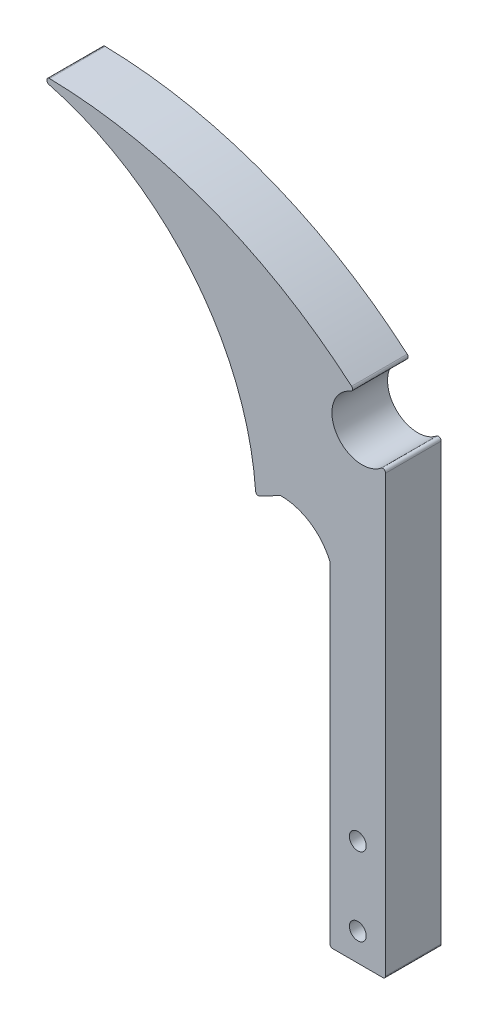
ISO-10303-21;
HEADER;
FILE_DESCRIPTION(('STEP AP214'),'2;1');
FILE_NAME('part.step','',(''),(''),'','','');
FILE_SCHEMA(('AUTOMOTIVE_DESIGN { 1 0 10303 214 1 1 1 1 }'));
ENDSEC;
DATA;
#1=APPLICATION_CONTEXT('core data for automotive mechanical design processes');
#2=APPLICATION_PROTOCOL_DEFINITION('international standard','automotive_design',2000,#1);
#3=PRODUCT_CONTEXT('',#1,'mechanical');
#4=PRODUCT('Part','Part','',(#3));
#5=PRODUCT_RELATED_PRODUCT_CATEGORY('part','',(#4));
#6=PRODUCT_DEFINITION_FORMATION('','',#4);
#7=PRODUCT_DEFINITION_CONTEXT('part definition',#1,'design');
#8=PRODUCT_DEFINITION('design','',#6,#7);
#9=PRODUCT_DEFINITION_SHAPE('','',#8);
#10=(LENGTH_UNIT() NAMED_UNIT(*) SI_UNIT(.MILLI.,.METRE.));
#11=(NAMED_UNIT(*) PLANE_ANGLE_UNIT() SI_UNIT($,.RADIAN.));
#12=(NAMED_UNIT(*) SI_UNIT($,.STERADIAN.) SOLID_ANGLE_UNIT());
#13=UNCERTAINTY_MEASURE_WITH_UNIT(LENGTH_MEASURE(1.E-05),#10,'distance_accuracy_value','');
#14=(GEOMETRIC_REPRESENTATION_CONTEXT(3) GLOBAL_UNCERTAINTY_ASSIGNED_CONTEXT((#13)) GLOBAL_UNIT_ASSIGNED_CONTEXT((#10,
#11,#12)) REPRESENTATION_CONTEXT('',''));
#15=CARTESIAN_POINT('',(0.,0.,0.));
#16=DIRECTION('',(0.,0.,1.));
#17=DIRECTION('',(1.,0.,0.));
#18=AXIS2_PLACEMENT_3D('',#15,#16,#17);
#19=CARTESIAN_POINT('',(0.,0.,10.));
#20=DIRECTION('',(0.,1.,0.));
#21=DIRECTION('',(-1.,0.,0.));
#22=AXIS2_PLACEMENT_3D('',#19,#20,#21);
#23=PLANE('',#22);
#24=DIRECTION('',(1.,0.,0.));
#25=VECTOR('',#24,1.);
#26=CARTESIAN_POINT('',(0.,0.,0.));
#27=LINE('',#26,#25);
#28=CARTESIAN_POINT('',(-9.5,0.,0.));
#29=VERTEX_POINT('',#28);
#30=CARTESIAN_POINT('',(-0.5,0.,0.));
#31=VERTEX_POINT('',#30);
#32=EDGE_CURVE('E182',#29,#31,#27,.T.);
#33=ORIENTED_EDGE('',*,*,#32,.T.);
#34=DIRECTION('',(0.,0.,-1.));
#35=VECTOR('',#34,1.);
#36=CARTESIAN_POINT('',(-0.5,0.,10.));
#37=LINE('',#36,#35);
#38=CARTESIAN_POINT('',(-0.5,0.,10.));
#39=VERTEX_POINT('',#38);
#40=EDGE_CURVE('E62',#31,#39,#37,.F.);
#41=ORIENTED_EDGE('',*,*,#40,.T.);
#42=DIRECTION('',(1.,0.,0.));
#43=VECTOR('',#42,1.);
#44=CARTESIAN_POINT('',(0.,0.,10.));
#45=LINE('',#44,#43);
#46=CARTESIAN_POINT('',(-9.5,0.,10.));
#47=VERTEX_POINT('',#46);
#48=EDGE_CURVE('E200',#47,#39,#45,.T.);
#49=ORIENTED_EDGE('',*,*,#48,.F.);
#50=DIRECTION('',(0.,0.,-1.));
#51=VECTOR('',#50,1.);
#52=CARTESIAN_POINT('',(-9.5,0.,10.));
#53=LINE('',#52,#51);
#54=EDGE_CURVE('E252',#47,#29,#53,.T.);
#55=ORIENTED_EDGE('',*,*,#54,.T.);
#56=EDGE_LOOP('',(#33,#41,#49,#55));
#57=FACE_BOUND('',#56,.T.);
#58=ADVANCED_FACE('F41',(#57),#23,.F.);
#59=CARTESIAN_POINT('',(0.,0.,10.));
#60=DIRECTION('',(-1.,0.,0.));
#61=DIRECTION('',(0.,0.,1.));
#62=AXIS2_PLACEMENT_3D('',#59,#60,#61);
#63=PLANE('',#62);
#64=DIRECTION('',(0.,1.,0.));
#65=VECTOR('',#64,1.);
#66=CARTESIAN_POINT('',(0.,0.,10.));
#67=LINE('',#66,#65);
#68=CARTESIAN_POINT('',(0.,0.5,10.));
#69=VERTEX_POINT('',#68);
#70=CARTESIAN_POINT('',(0.,78.7921339962123,10.));
#71=VERTEX_POINT('',#70);
#72=EDGE_CURVE('E259',#69,#71,#67,.T.);
#73=ORIENTED_EDGE('',*,*,#72,.F.);
#74=DIRECTION('',(0.,0.,-1.));
#75=VECTOR('',#74,1.);
#76=CARTESIAN_POINT('',(0.,0.5,10.));
#77=LINE('',#76,#75);
#78=CARTESIAN_POINT('',(0.,0.5,0.));
#79=VERTEX_POINT('',#78);
#80=EDGE_CURVE('E245',#69,#79,#77,.T.);
#81=ORIENTED_EDGE('',*,*,#80,.T.);
#82=DIRECTION('',(0.,1.,0.));
#83=VECTOR('',#82,1.);
#84=CARTESIAN_POINT('',(0.,0.,0.));
#85=LINE('',#84,#83);
#86=CARTESIAN_POINT('',(0.,78.7921339962123,0.));
#87=VERTEX_POINT('',#86);
#88=EDGE_CURVE('E184',#79,#87,#85,.T.);
#89=ORIENTED_EDGE('',*,*,#88,.T.);
#90=DIRECTION('',(0.,0.,-1.));
#91=VECTOR('',#90,1.);
#92=CARTESIAN_POINT('',(0.,78.7921339962123,10.));
#93=LINE('',#92,#91);
#94=EDGE_CURVE('E215',#87,#71,#93,.F.);
#95=ORIENTED_EDGE('',*,*,#94,.T.);
#96=EDGE_LOOP('',(#73,#81,#89,#95));
#97=FACE_BOUND('',#96,.T.);
#98=ADVANCED_FACE('F263',(#97),#63,.F.);
#99=CARTESIAN_POINT('',(-4.23252225407962,83.3939166116122,10.));
#100=DIRECTION('',(0.,0.,-1.));
#101=DIRECTION('',(-1.,0.,0.));
#102=AXIS2_PLACEMENT_3D('',#99,#100,#101);
#103=CYLINDRICAL_SURFACE('',#102,5.42521101873989);
#104=CARTESIAN_POINT('',(-4.23252225407962,83.3939166116122,10.));
#105=DIRECTION('',(0.,0.,-1.));
#106=DIRECTION('',(-1.,0.,0.));
#107=AXIS2_PLACEMENT_3D('',#104,#105,#106);
#108=CIRCLE('',#107,5.42521101873989);
#109=CARTESIAN_POINT('',(-0.814969563301174,79.1804562518118,10.));
#110=VERTEX_POINT('',#109);
#111=CARTESIAN_POINT('',(-6.26131478111203,88.4255083557936,10.));
#112=VERTEX_POINT('',#111);
#113=EDGE_CURVE('E267',#110,#112,#108,.T.);
#114=ORIENTED_EDGE('',*,*,#113,.F.);
#115=DIRECTION('',(0.,0.,-1.));
#116=VECTOR('',#115,1.);
#117=CARTESIAN_POINT('',(-0.814969563301175,79.1804562518118,10.));
#118=LINE('',#117,#116);
#119=CARTESIAN_POINT('',(-0.814969563301174,79.1804562518118,0.));
#120=VERTEX_POINT('',#119);
#121=EDGE_CURVE('E203',#110,#120,#118,.T.);
#122=ORIENTED_EDGE('',*,*,#121,.T.);
#123=CARTESIAN_POINT('',(-4.23252225407962,83.3939166116122,0.));
#124=DIRECTION('',(0.,0.,-1.));
#125=DIRECTION('',(-1.,0.,0.));
#126=AXIS2_PLACEMENT_3D('',#123,#124,#125);
#127=CIRCLE('',#126,5.42521101873989);
#128=CARTESIAN_POINT('',(-6.26131478111203,88.4255083557936,0.));
#129=VERTEX_POINT('',#128);
#130=EDGE_CURVE('E187',#120,#129,#127,.T.);
#131=ORIENTED_EDGE('',*,*,#130,.T.);
#132=DIRECTION('',(0.,0.,-1.));
#133=VECTOR('',#132,1.);
#134=CARTESIAN_POINT('',(-6.26131478111203,88.4255083557936,10.));
#135=LINE('',#134,#133);
#136=EDGE_CURVE('E172',#129,#112,#135,.F.);
#137=ORIENTED_EDGE('',*,*,#136,.T.);
#138=EDGE_LOOP('',(#114,#122,#131,#137));
#139=FACE_BOUND('',#138,.T.);
#140=ADVANCED_FACE('F306',(#139),#103,.F.);
#141=CARTESIAN_POINT('',(-62.157001452402,24.1022049188398,10.));
#142=DIRECTION('',(0.,0.,-1.));
#143=DIRECTION('',(-1.,0.,0.));
#144=AXIS2_PLACEMENT_3D('',#141,#142,#143);
#145=CYLINDRICAL_SURFACE('',#144,85.944830214194);
#146=CARTESIAN_POINT('',(-62.157001452402,24.1022049188398,10.));
#147=DIRECTION('',(0.,0.,1.));
#148=DIRECTION('',(-1.,0.,0.));
#149=AXIS2_PLACEMENT_3D('',#146,#147,#148);
#150=CIRCLE('',#149,85.944830214194);
#151=CARTESIAN_POINT('',(-6.12230072370439,89.2683476218718,10.));
#152=VERTEX_POINT('',#151);
#153=CARTESIAN_POINT('',(-60.4129441365924,110.029337447662,10.));
#154=VERTEX_POINT('',#153);
#155=EDGE_CURVE('E324',#152,#154,#150,.T.);
#156=ORIENTED_EDGE('',*,*,#155,.F.);
#157=DIRECTION('',(0.,0.,-1.));
#158=VECTOR('',#157,1.);
#159=CARTESIAN_POINT('',(-6.12230072370438,89.2683476218718,10.));
#160=LINE('',#159,#158);
#161=CARTESIAN_POINT('',(-6.12230072370439,89.2683476218718,0.));
#162=VERTEX_POINT('',#161);
#163=EDGE_CURVE('E227',#152,#162,#160,.T.);
#164=ORIENTED_EDGE('',*,*,#163,.T.);
#165=CARTESIAN_POINT('',(-62.157001452402,24.1022049188398,0.));
#166=DIRECTION('',(0.,0.,1.));
#167=DIRECTION('',(-1.,0.,0.));
#168=AXIS2_PLACEMENT_3D('',#165,#166,#167);
#169=CIRCLE('',#168,85.944830214194);
#170=CARTESIAN_POINT('',(-60.4129441365924,110.029337447662,0.));
#171=VERTEX_POINT('',#170);
#172=EDGE_CURVE('E190',#162,#171,#169,.T.);
#173=ORIENTED_EDGE('',*,*,#172,.T.);
#174=DIRECTION('',(0.,0.,-1.));
#175=VECTOR('',#174,1.);
#176=CARTESIAN_POINT('',(-60.4129441365924,110.029337447662,10.));
#177=LINE('',#176,#175);
#178=EDGE_CURVE('E225',#171,#154,#177,.F.);
#179=ORIENTED_EDGE('',*,*,#178,.T.);
#180=EDGE_LOOP('',(#156,#164,#173,#179));
#181=FACE_BOUND('',#180,.T.);
#182=ADVANCED_FACE('F328',(#181),#145,.T.);
#183=CARTESIAN_POINT('',(-73.247041918645,60.6848268826712,10.));
#184=DIRECTION('',(0.,0.,-1.));
#185=DIRECTION('',(-1.,0.,0.));
#186=AXIS2_PLACEMENT_3D('',#183,#184,#185);
#187=CYLINDRICAL_SURFACE('',#186,50.);
#188=CARTESIAN_POINT('',(-73.247041918645,60.6848268826712,0.));
#189=DIRECTION('',(0.,0.,-1.));
#190=DIRECTION('',(1.,0.,0.));
#191=AXIS2_PLACEMENT_3D('',#188,#189,#190);
#192=CIRCLE('',#191,50.);
#193=CARTESIAN_POINT('',(-60.5500603295917,109.045830372335,0.));
#194=VERTEX_POINT('',#193);
#195=CARTESIAN_POINT('',(-23.3772859328582,64.2914094642967,0.));
#196=VERTEX_POINT('',#195);
#197=EDGE_CURVE('E193',#194,#196,#192,.T.);
#198=ORIENTED_EDGE('',*,*,#197,.T.);
#199=DIRECTION('',(0.,0.,-1.));
#200=VECTOR('',#199,1.);
#201=CARTESIAN_POINT('',(-23.3772859328582,64.2914094642967,10.));
#202=LINE('',#201,#200);
#203=CARTESIAN_POINT('',(-23.3772859328582,64.2914094642967,10.));
#204=VERTEX_POINT('',#203);
#205=EDGE_CURVE('E239',#196,#204,#202,.F.);
#206=ORIENTED_EDGE('',*,*,#205,.T.);
#207=CARTESIAN_POINT('',(-73.247041918645,60.6848268826712,10.));
#208=DIRECTION('',(0.,0.,-1.));
#209=DIRECTION('',(1.,0.,0.));
#210=AXIS2_PLACEMENT_3D('',#207,#208,#209);
#211=CIRCLE('',#210,50.);
#212=CARTESIAN_POINT('',(-60.5500603295917,109.045830372335,10.));
#213=VERTEX_POINT('',#212);
#214=EDGE_CURVE('E162',#213,#204,#211,.T.);
#215=ORIENTED_EDGE('',*,*,#214,.F.);
#216=DIRECTION('',(0.,0.,-1.));
#217=VECTOR('',#216,1.);
#218=CARTESIAN_POINT('',(-60.5500603295917,109.045830372335,10.));
#219=LINE('',#218,#217);
#220=EDGE_CURVE('E236',#213,#194,#219,.T.);
#221=ORIENTED_EDGE('',*,*,#220,.T.);
#222=EDGE_LOOP('',(#198,#206,#215,#221));
#223=FACE_BOUND('',#222,.T.);
#224=ADVANCED_FACE('F285',(#223),#187,.F.);
#225=CARTESIAN_POINT('',(-18.9071944850689,65.8609315322782,10.));
#226=DIRECTION('',(-0.46727793315085,0.884110475670473,0.));
#227=DIRECTION('',(-0.884110475670473,-0.46727793315085,0.));
#228=AXIS2_PLACEMENT_3D('',#225,#226,#227);
#229=PLANE('',#228);
#230=DIRECTION('',(0.884110475670473,0.46727793315085,0.));
#231=VECTOR('',#230,1.);
#232=CARTESIAN_POINT('',(-18.9071944850689,65.8609315322782,10.));
#233=LINE('',#232,#231);
#234=CARTESIAN_POINT('',(-22.6449494064249,63.8854200522778,10.));
#235=VERTEX_POINT('',#234);
#236=CARTESIAN_POINT('',(-18.9071944850689,65.8609315322782,10.));
#237=VERTEX_POINT('',#236);
#238=EDGE_CURVE('E150',#235,#237,#233,.T.);
#239=ORIENTED_EDGE('',*,*,#238,.F.);
#240=DIRECTION('',(0.,0.,-1.));
#241=VECTOR('',#240,1.);
#242=CARTESIAN_POINT('',(-22.6449494064249,63.8854200522778,10.));
#243=LINE('',#242,#241);
#244=CARTESIAN_POINT('',(-22.6449494064249,63.8854200522778,0.));
#245=VERTEX_POINT('',#244);
#246=EDGE_CURVE('E234',#235,#245,#243,.T.);
#247=ORIENTED_EDGE('',*,*,#246,.T.);
#248=DIRECTION('',(0.884110475670473,0.46727793315085,0.));
#249=VECTOR('',#248,1.);
#250=CARTESIAN_POINT('',(-18.9071944850689,65.8609315322782,0.));
#251=LINE('',#250,#249);
#252=CARTESIAN_POINT('',(-18.9071944850689,65.8609315322782,0.));
#253=VERTEX_POINT('',#252);
#254=EDGE_CURVE('E168',#245,#253,#251,.T.);
#255=ORIENTED_EDGE('',*,*,#254,.T.);
#256=DIRECTION('',(0.,0.,-1.));
#257=VECTOR('',#256,1.);
#258=CARTESIAN_POINT('',(-18.9071944850689,65.8609315322782,10.));
#259=LINE('',#258,#257);
#260=EDGE_CURVE('E165',#237,#253,#259,.T.);
#261=ORIENTED_EDGE('',*,*,#260,.F.);
#262=EDGE_LOOP('',(#239,#247,#255,#261));
#263=FACE_BOUND('',#262,.T.);
#264=ADVANCED_FACE('F166',(#263),#229,.F.);
#265=CARTESIAN_POINT('',(-18.8091453253625,56.3110890255721,10.));
#266=DIRECTION('',(0.,0.,-1.));
#267=DIRECTION('',(-1.,0.,0.));
#268=AXIS2_PLACEMENT_3D('',#265,#266,#267);
#269=CYLINDRICAL_SURFACE('',#268,9.55034583356069);
#270=CARTESIAN_POINT('',(-18.8091453253625,56.3110890255721,0.));
#271=DIRECTION('',(0.,0.,-1.));
#272=DIRECTION('',(1.,0.,0.));
#273=AXIS2_PLACEMENT_3D('',#270,#271,#272);
#274=CIRCLE('',#273,9.55034583356069);
#275=CARTESIAN_POINT('',(-10.0409487395194,60.0963015919441,0.));
#276=VERTEX_POINT('',#275);
#277=EDGE_CURVE('E197',#253,#276,#274,.T.);
#278=ORIENTED_EDGE('',*,*,#277,.T.);
#279=DIRECTION('',(0.,0.,-1.));
#280=VECTOR('',#279,1.);
#281=CARTESIAN_POINT('',(-10.0409487395194,60.0963015919441,10.));
#282=LINE('',#281,#280);
#283=CARTESIAN_POINT('',(-10.0409487395194,60.0963015919441,10.));
#284=VERTEX_POINT('',#283);
#285=EDGE_CURVE('E177',#276,#284,#282,.F.);
#286=ORIENTED_EDGE('',*,*,#285,.T.);
#287=CARTESIAN_POINT('',(-18.8091453253625,56.3110890255721,10.));
#288=DIRECTION('',(0.,0.,-1.));
#289=DIRECTION('',(1.,0.,0.));
#290=AXIS2_PLACEMENT_3D('',#287,#288,#289);
#291=CIRCLE('',#290,9.55034583356069);
#292=EDGE_CURVE('E154',#237,#284,#291,.T.);
#293=ORIENTED_EDGE('',*,*,#292,.F.);
#294=ORIENTED_EDGE('',*,*,#260,.T.);
#295=EDGE_LOOP('',(#278,#286,#293,#294));
#296=FACE_BOUND('',#295,.T.);
#297=ADVANCED_FACE('F175',(#296),#269,.F.);
#298=CARTESIAN_POINT('',(-10.,0.,10.));
#299=DIRECTION('',(1.,0.,0.));
#300=DIRECTION('',(0.,0.,-1.));
#301=AXIS2_PLACEMENT_3D('',#298,#299,#300);
#302=PLANE('',#301);
#303=DIRECTION('',(0.,-1.,0.));
#304=VECTOR('',#303,1.);
#305=CARTESIAN_POINT('',(-10.,0.,0.));
#306=LINE('',#305,#304);
#307=CARTESIAN_POINT('',(-10.,59.8981300999196,0.));
#308=VERTEX_POINT('',#307);
#309=CARTESIAN_POINT('',(-10.,0.499999999999999,0.));
#310=VERTEX_POINT('',#309);
#311=EDGE_CURVE('E199',#308,#310,#306,.T.);
#312=ORIENTED_EDGE('',*,*,#311,.T.);
#313=DIRECTION('',(0.,0.,-1.));
#314=VECTOR('',#313,1.);
#315=CARTESIAN_POINT('',(-10.,0.499999999999999,10.));
#316=LINE('',#315,#314);
#317=CARTESIAN_POINT('',(-10.,0.499999999999999,10.));
#318=VERTEX_POINT('',#317);
#319=EDGE_CURVE('E11',#310,#318,#316,.F.);
#320=ORIENTED_EDGE('',*,*,#319,.T.);
#321=DIRECTION('',(0.,-1.,0.));
#322=VECTOR('',#321,1.);
#323=CARTESIAN_POINT('',(-10.,0.,10.));
#324=LINE('',#323,#322);
#325=CARTESIAN_POINT('',(-10.,59.8981300999196,10.));
#326=VERTEX_POINT('',#325);
#327=EDGE_CURVE('E173',#326,#318,#324,.T.);
#328=ORIENTED_EDGE('',*,*,#327,.F.);
#329=DIRECTION('',(0.,0.,1.));
#330=VECTOR('',#329,1.);
#331=CARTESIAN_POINT('',(-10.,59.8981300999196,0.));
#332=LINE('',#331,#330);
#333=EDGE_CURVE('E230',#326,#308,#332,.F.);
#334=ORIENTED_EDGE('',*,*,#333,.T.);
#335=EDGE_LOOP('',(#312,#320,#328,#334));
#336=FACE_BOUND('',#335,.T.);
#337=ADVANCED_FACE('F277',(#336),#302,.F.);
#338=CARTESIAN_POINT('',(-18.8091453253625,56.3110890255721,10.));
#339=DIRECTION('',(0.,0.,1.));
#340=DIRECTION('',(1.,0.,0.));
#341=AXIS2_PLACEMENT_3D('',#338,#339,#340);
#342=PLANE('',#341);
#343=CARTESIAN_POINT('',(-5.,5.,10.));
#344=DIRECTION('',(0.,0.,1.));
#345=DIRECTION('',(1.,0.,0.));
#346=AXIS2_PLACEMENT_3D('',#343,#344,#345);
#347=CIRCLE('',#346,1.515);
#348=CARTESIAN_POINT('',(-3.485,5.,10.));
#349=VERTEX_POINT('',#348);
#350=EDGE_CURVE('E341',#349,#349,#347,.T.);
#351=ORIENTED_EDGE('',*,*,#350,.F.);
#352=EDGE_LOOP('',(#351));
#353=FACE_BOUND('',#352,.T.);
#354=CARTESIAN_POINT('',(-5.,19.,10.));
#355=DIRECTION('',(0.,0.,1.));
#356=DIRECTION('',(1.,0.,0.));
#357=AXIS2_PLACEMENT_3D('',#354,#355,#356);
#358=CIRCLE('',#357,1.515);
#359=CARTESIAN_POINT('',(-3.485,19.,10.));
#360=VERTEX_POINT('',#359);
#361=EDGE_CURVE('E338',#360,#360,#358,.T.);
#362=ORIENTED_EDGE('',*,*,#361,.F.);
#363=EDGE_LOOP('',(#362));
#364=FACE_BOUND('',#363,.T.);
#365=ORIENTED_EDGE('',*,*,#48,.T.);
#366=CARTESIAN_POINT('',(-0.5,0.5,10.));
#367=DIRECTION('',(0.,0.,1.));
#368=DIRECTION('',(1.,0.,0.));
#369=AXIS2_PLACEMENT_3D('',#366,#367,#368);
#370=CIRCLE('',#369,0.5);
#371=EDGE_CURVE('E49',#39,#69,#370,.T.);
#372=ORIENTED_EDGE('',*,*,#371,.T.);
#373=ORIENTED_EDGE('',*,*,#72,.T.);
#374=CARTESIAN_POINT('',(-0.5,78.7921339962123,10.));
#375=DIRECTION('',(0.,0.,1.));
#376=DIRECTION('',(1.,0.,0.));
#377=AXIS2_PLACEMENT_3D('',#374,#375,#376);
#378=CIRCLE('',#377,0.5);
#379=EDGE_CURVE('E223',#71,#110,#378,.T.);
#380=ORIENTED_EDGE('',*,*,#379,.T.);
#381=ORIENTED_EDGE('',*,*,#113,.T.);
#382=CARTESIAN_POINT('',(-6.44829299449627,88.8892314927188,10.));
#383=DIRECTION('',(0.,0.,1.));
#384=DIRECTION('',(1.,0.,0.));
#385=AXIS2_PLACEMENT_3D('',#382,#383,#384);
#386=CIRCLE('',#385,0.5);
#387=EDGE_CURVE('E221',#112,#152,#386,.T.);
#388=ORIENTED_EDGE('',*,*,#387,.T.);
#389=ORIENTED_EDGE('',*,*,#155,.T.);
#390=CARTESIAN_POINT('',(-60.4230905137012,109.529440407231,10.));
#391=DIRECTION('',(0.,0.,1.));
#392=DIRECTION('',(1.,0.,0.));
#393=AXIS2_PLACEMENT_3D('',#390,#391,#392);
#394=CIRCLE('',#393,0.5);
#395=EDGE_CURVE('E218',#154,#213,#394,.T.);
#396=ORIENTED_EDGE('',*,*,#395,.T.);
#397=ORIENTED_EDGE('',*,*,#214,.T.);
#398=CARTESIAN_POINT('',(-22.8785883730003,64.327475290113,10.));
#399=DIRECTION('',(0.,0.,1.));
#400=DIRECTION('',(1.,0.,0.));
#401=AXIS2_PLACEMENT_3D('',#398,#399,#400);
#402=CIRCLE('',#401,0.5);
#403=EDGE_CURVE('E158',#204,#235,#402,.T.);
#404=ORIENTED_EDGE('',*,*,#403,.T.);
#405=ORIENTED_EDGE('',*,*,#238,.T.);
#406=ORIENTED_EDGE('',*,*,#292,.T.);
#407=CARTESIAN_POINT('',(-10.5,59.8981300999196,10.));
#408=DIRECTION('',(0.,0.,1.));
#409=DIRECTION('',(1.,0.,0.));
#410=AXIS2_PLACEMENT_3D('',#407,#408,#409);
#411=CIRCLE('',#410,0.5);
#412=EDGE_CURVE('E243',#284,#326,#411,.F.);
#413=ORIENTED_EDGE('',*,*,#412,.T.);
#414=ORIENTED_EDGE('',*,*,#327,.T.);
#415=CARTESIAN_POINT('',(-9.5,0.499999999999999,10.));
#416=DIRECTION('',(0.,0.,1.));
#417=DIRECTION('',(1.,0.,0.));
#418=AXIS2_PLACEMENT_3D('',#415,#416,#417);
#419=CIRCLE('',#418,0.5);
#420=EDGE_CURVE('E256',#318,#47,#419,.T.);
#421=ORIENTED_EDGE('',*,*,#420,.T.);
#422=EDGE_LOOP('',(#365,#372,#373,#380,#381,#388,#389,#396,#397,#404,#405,#406,#413,#414,#421));
#423=FACE_BOUND('',#422,.T.);
#424=ADVANCED_FACE('F152',(#353,#364,#423),#342,.T.);
#425=CARTESIAN_POINT('',(-18.8091453253625,56.3110890255721,0.));
#426=DIRECTION('',(0.,0.,1.));
#427=DIRECTION('',(1.,0.,0.));
#428=AXIS2_PLACEMENT_3D('',#425,#426,#427);
#429=PLANE('',#428);
#430=CARTESIAN_POINT('',(-5.,5.,0.));
#431=DIRECTION('',(0.,0.,1.));
#432=DIRECTION('',(1.,0.,0.));
#433=AXIS2_PLACEMENT_3D('',#430,#431,#432);
#434=CIRCLE('',#433,1.515);
#435=CARTESIAN_POINT('',(-3.485,5.,0.));
#436=VERTEX_POINT('',#435);
#437=EDGE_CURVE('E185',#436,#436,#434,.T.);
#438=ORIENTED_EDGE('',*,*,#437,.T.);
#439=EDGE_LOOP('',(#438));
#440=FACE_BOUND('',#439,.T.);
#441=CARTESIAN_POINT('',(-5.,19.,0.));
#442=DIRECTION('',(0.,0.,1.));
#443=DIRECTION('',(1.,0.,0.));
#444=AXIS2_PLACEMENT_3D('',#441,#442,#443);
#445=CIRCLE('',#444,1.515);
#446=CARTESIAN_POINT('',(-3.485,19.,0.));
#447=VERTEX_POINT('',#446);
#448=EDGE_CURVE('E335',#447,#447,#445,.T.);
#449=ORIENTED_EDGE('',*,*,#448,.T.);
#450=EDGE_LOOP('',(#449));
#451=FACE_BOUND('',#450,.T.);
#452=ORIENTED_EDGE('',*,*,#88,.F.);
#453=CARTESIAN_POINT('',(-0.5,0.5,0.));
#454=DIRECTION('',(0.,0.,1.));
#455=DIRECTION('',(1.,0.,0.));
#456=AXIS2_PLACEMENT_3D('',#453,#454,#455);
#457=CIRCLE('',#456,0.5);
#458=EDGE_CURVE('E250',#79,#31,#457,.F.);
#459=ORIENTED_EDGE('',*,*,#458,.T.);
#460=ORIENTED_EDGE('',*,*,#32,.F.);
#461=CARTESIAN_POINT('',(-9.5,0.499999999999999,0.));
#462=DIRECTION('',(0.,0.,1.));
#463=DIRECTION('',(1.,0.,0.));
#464=AXIS2_PLACEMENT_3D('',#461,#462,#463);
#465=CIRCLE('',#464,0.5);
#466=EDGE_CURVE('E248',#29,#310,#465,.F.);
#467=ORIENTED_EDGE('',*,*,#466,.T.);
#468=ORIENTED_EDGE('',*,*,#311,.F.);
#469=CARTESIAN_POINT('',(-10.5,59.8981300999196,0.));
#470=DIRECTION('',(0.,0.,1.));
#471=DIRECTION('',(1.,0.,0.));
#472=AXIS2_PLACEMENT_3D('',#469,#470,#471);
#473=CIRCLE('',#472,0.5);
#474=EDGE_CURVE('E241',#308,#276,#473,.T.);
#475=ORIENTED_EDGE('',*,*,#474,.T.);
#476=ORIENTED_EDGE('',*,*,#277,.F.);
#477=ORIENTED_EDGE('',*,*,#254,.F.);
#478=CARTESIAN_POINT('',(-22.8785883730003,64.327475290113,0.));
#479=DIRECTION('',(0.,0.,1.));
#480=DIRECTION('',(1.,0.,0.));
#481=AXIS2_PLACEMENT_3D('',#478,#479,#480);
#482=CIRCLE('',#481,0.5);
#483=EDGE_CURVE('E208',#245,#196,#482,.F.);
#484=ORIENTED_EDGE('',*,*,#483,.T.);
#485=ORIENTED_EDGE('',*,*,#197,.F.);
#486=CARTESIAN_POINT('',(-60.4230905137012,109.529440407231,0.));
#487=DIRECTION('',(0.,0.,1.));
#488=DIRECTION('',(1.,0.,0.));
#489=AXIS2_PLACEMENT_3D('',#486,#487,#488);
#490=CIRCLE('',#489,0.5);
#491=EDGE_CURVE('E206',#194,#171,#490,.F.);
#492=ORIENTED_EDGE('',*,*,#491,.T.);
#493=ORIENTED_EDGE('',*,*,#172,.F.);
#494=CARTESIAN_POINT('',(-6.44829299449627,88.8892314927188,0.));
#495=DIRECTION('',(0.,0.,1.));
#496=DIRECTION('',(1.,0.,0.));
#497=AXIS2_PLACEMENT_3D('',#494,#495,#496);
#498=CIRCLE('',#497,0.5);
#499=EDGE_CURVE('E210',#162,#129,#498,.F.);
#500=ORIENTED_EDGE('',*,*,#499,.T.);
#501=ORIENTED_EDGE('',*,*,#130,.F.);
#502=CARTESIAN_POINT('',(-0.5,78.7921339962123,0.));
#503=DIRECTION('',(0.,0.,1.));
#504=DIRECTION('',(1.,0.,0.));
#505=AXIS2_PLACEMENT_3D('',#502,#503,#504);
#506=CIRCLE('',#505,0.5);
#507=EDGE_CURVE('E212',#120,#87,#506,.F.);
#508=ORIENTED_EDGE('',*,*,#507,.T.);
#509=EDGE_LOOP('',(#452,#459,#460,#467,#468,#475,#476,#477,#484,#485,#492,#493,#500,#501,#508));
#510=FACE_BOUND('',#509,.T.);
#511=ADVANCED_FACE('F272',(#440,#451,#510),#429,.F.);
#512=CARTESIAN_POINT('',(-0.5,78.7921339962123,10.));
#513=DIRECTION('',(0.,0.,-1.));
#514=DIRECTION('',(-1.,0.,0.));
#515=AXIS2_PLACEMENT_3D('',#512,#513,#514);
#516=CYLINDRICAL_SURFACE('',#515,0.5);
#517=ORIENTED_EDGE('',*,*,#379,.F.);
#518=ORIENTED_EDGE('',*,*,#94,.F.);
#519=ORIENTED_EDGE('',*,*,#507,.F.);
#520=ORIENTED_EDGE('',*,*,#121,.F.);
#521=EDGE_LOOP('',(#517,#518,#519,#520));
#522=FACE_BOUND('',#521,.T.);
#523=ADVANCED_FACE('F310',(#522),#516,.T.);
#524=CARTESIAN_POINT('',(-6.44829299449627,88.8892314927188,10.));
#525=DIRECTION('',(0.,0.,1.));
#526=DIRECTION('',(1.,0.,0.));
#527=AXIS2_PLACEMENT_3D('',#524,#525,#526);
#528=CYLINDRICAL_SURFACE('',#527,0.5);
#529=ORIENTED_EDGE('',*,*,#387,.F.);
#530=ORIENTED_EDGE('',*,*,#136,.F.);
#531=ORIENTED_EDGE('',*,*,#499,.F.);
#532=ORIENTED_EDGE('',*,*,#163,.F.);
#533=EDGE_LOOP('',(#529,#530,#531,#532));
#534=FACE_BOUND('',#533,.T.);
#535=ADVANCED_FACE('F299',(#534),#528,.T.);
#536=CARTESIAN_POINT('',(-10.5,59.8981300999196,10.));
#537=DIRECTION('',(0.,0.,-1.));
#538=DIRECTION('',(-1.,0.,0.));
#539=AXIS2_PLACEMENT_3D('',#536,#537,#538);
#540=CYLINDRICAL_SURFACE('',#539,0.5);
#541=ORIENTED_EDGE('',*,*,#412,.F.);
#542=ORIENTED_EDGE('',*,*,#285,.F.);
#543=ORIENTED_EDGE('',*,*,#474,.F.);
#544=ORIENTED_EDGE('',*,*,#333,.F.);
#545=EDGE_LOOP('',(#541,#542,#543,#544));
#546=FACE_BOUND('',#545,.T.);
#547=ADVANCED_FACE('F280',(#546),#540,.F.);
#548=CARTESIAN_POINT('',(-22.8785883730003,64.327475290113,10.));
#549=DIRECTION('',(0.,0.,-1.));
#550=DIRECTION('',(-1.,0.,0.));
#551=AXIS2_PLACEMENT_3D('',#548,#549,#550);
#552=CYLINDRICAL_SURFACE('',#551,0.5);
#553=ORIENTED_EDGE('',*,*,#403,.F.);
#554=ORIENTED_EDGE('',*,*,#205,.F.);
#555=ORIENTED_EDGE('',*,*,#483,.F.);
#556=ORIENTED_EDGE('',*,*,#246,.F.);
#557=EDGE_LOOP('',(#553,#554,#555,#556));
#558=FACE_BOUND('',#557,.T.);
#559=ADVANCED_FACE('F288',(#558),#552,.T.);
#560=CARTESIAN_POINT('',(-60.4230905137012,109.529440407231,10.));
#561=DIRECTION('',(0.,0.,1.));
#562=DIRECTION('',(1.,0.,0.));
#563=AXIS2_PLACEMENT_3D('',#560,#561,#562);
#564=CYLINDRICAL_SURFACE('',#563,0.5);
#565=ORIENTED_EDGE('',*,*,#395,.F.);
#566=ORIENTED_EDGE('',*,*,#178,.F.);
#567=ORIENTED_EDGE('',*,*,#491,.F.);
#568=ORIENTED_EDGE('',*,*,#220,.F.);
#569=EDGE_LOOP('',(#565,#566,#567,#568));
#570=FACE_BOUND('',#569,.T.);
#571=ADVANCED_FACE('F290',(#570),#564,.T.);
#572=CARTESIAN_POINT('',(-5.,19.,0.));
#573=DIRECTION('',(0.,0.,1.));
#574=DIRECTION('',(1.,0.,0.));
#575=AXIS2_PLACEMENT_3D('',#572,#573,#574);
#576=CYLINDRICAL_SURFACE('',#575,1.515);
#577=ORIENTED_EDGE('',*,*,#448,.F.);
#578=EDGE_LOOP('',(#577));
#579=FACE_BOUND('',#578,.T.);
#580=ORIENTED_EDGE('',*,*,#361,.T.);
#581=EDGE_LOOP('',(#580));
#582=FACE_BOUND('',#581,.T.);
#583=ADVANCED_FACE('F296',(#579,#582),#576,.F.);
#584=CARTESIAN_POINT('',(-5.,5.,0.));
#585=DIRECTION('',(0.,0.,1.));
#586=DIRECTION('',(1.,0.,0.));
#587=AXIS2_PLACEMENT_3D('',#584,#585,#586);
#588=CYLINDRICAL_SURFACE('',#587,1.515);
#589=ORIENTED_EDGE('',*,*,#437,.F.);
#590=EDGE_LOOP('',(#589));
#591=FACE_BOUND('',#590,.T.);
#592=ORIENTED_EDGE('',*,*,#350,.T.);
#593=EDGE_LOOP('',(#592));
#594=FACE_BOUND('',#593,.T.);
#595=ADVANCED_FACE('F349',(#591,#594),#588,.F.);
#596=CARTESIAN_POINT('',(-0.5,0.5,10.));
#597=DIRECTION('',(0.,0.,-1.));
#598=DIRECTION('',(-1.,0.,0.));
#599=AXIS2_PLACEMENT_3D('',#596,#597,#598);
#600=CYLINDRICAL_SURFACE('',#599,0.5);
#601=ORIENTED_EDGE('',*,*,#371,.F.);
#602=ORIENTED_EDGE('',*,*,#40,.F.);
#603=ORIENTED_EDGE('',*,*,#458,.F.);
#604=ORIENTED_EDGE('',*,*,#80,.F.);
#605=EDGE_LOOP('',(#601,#602,#603,#604));
#606=FACE_BOUND('',#605,.T.);
#607=ADVANCED_FACE('F269',(#606),#600,.T.);
#608=CARTESIAN_POINT('',(-9.5,0.499999999999999,10.));
#609=DIRECTION('',(0.,0.,-1.));
#610=DIRECTION('',(-1.,0.,0.));
#611=AXIS2_PLACEMENT_3D('',#608,#609,#610);
#612=CYLINDRICAL_SURFACE('',#611,0.5);
#613=ORIENTED_EDGE('',*,*,#420,.F.);
#614=ORIENTED_EDGE('',*,*,#319,.F.);
#615=ORIENTED_EDGE('',*,*,#466,.F.);
#616=ORIENTED_EDGE('',*,*,#54,.F.);
#617=EDGE_LOOP('',(#613,#614,#615,#616));
#618=FACE_BOUND('',#617,.T.);
#619=ADVANCED_FACE('F43',(#618),#612,.T.);
#620=CLOSED_SHELL('',(#58,#98,#140,#182,#224,#264,#297,#337,#424,#511,#523,#535,#547,#559,#571,
#583,#595,#607,#619));
#621=MANIFOLD_SOLID_BREP('B2',#620);
#622=ADVANCED_BREP_SHAPE_REPRESENTATION('',(#18,#621),#14);
#623=SHAPE_DEFINITION_REPRESENTATION(#9,#622);
ENDSEC;
END-ISO-10303-21;
